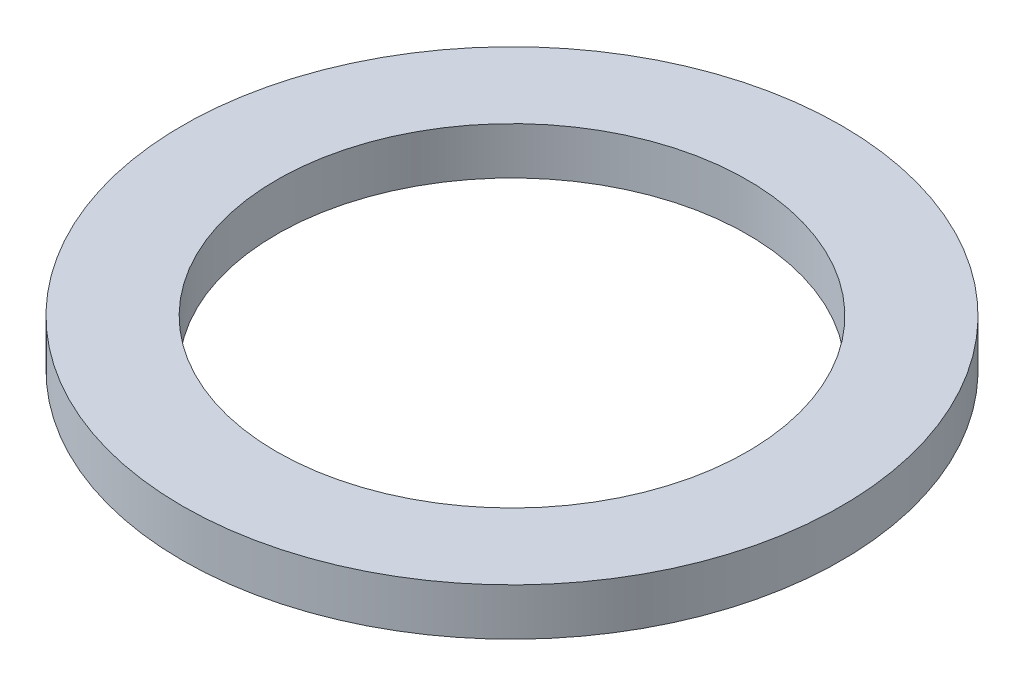
ISO-10303-21;
HEADER;
FILE_DESCRIPTION(('STEP AP214'),'2;1');
FILE_NAME('part.step','',(''),(''),'','','');
FILE_SCHEMA(('AUTOMOTIVE_DESIGN { 1 0 10303 214 1 1 1 1 }'));
ENDSEC;
DATA;
#1=APPLICATION_CONTEXT('core data for automotive mechanical design processes');
#2=APPLICATION_PROTOCOL_DEFINITION('international standard','automotive_design',2000,#1);
#3=PRODUCT_CONTEXT('',#1,'mechanical');
#4=PRODUCT('Part','Part','',(#3));
#5=PRODUCT_RELATED_PRODUCT_CATEGORY('part','',(#4));
#6=PRODUCT_DEFINITION_FORMATION('','',#4);
#7=PRODUCT_DEFINITION_CONTEXT('part definition',#1,'design');
#8=PRODUCT_DEFINITION('design','',#6,#7);
#9=PRODUCT_DEFINITION_SHAPE('','',#8);
#10=(LENGTH_UNIT() NAMED_UNIT(*) SI_UNIT(.MILLI.,.METRE.));
#11=(NAMED_UNIT(*) PLANE_ANGLE_UNIT() SI_UNIT($,.RADIAN.));
#12=(NAMED_UNIT(*) SI_UNIT($,.STERADIAN.) SOLID_ANGLE_UNIT());
#13=UNCERTAINTY_MEASURE_WITH_UNIT(LENGTH_MEASURE(1.E-05),#10,'distance_accuracy_value','');
#14=(GEOMETRIC_REPRESENTATION_CONTEXT(3) GLOBAL_UNCERTAINTY_ASSIGNED_CONTEXT((#13)) GLOBAL_UNIT_ASSIGNED_CONTEXT((#10,
#11,#12)) REPRESENTATION_CONTEXT('',''));
#15=CARTESIAN_POINT('',(0.,0.,0.));
#16=DIRECTION('',(0.,0.,1.));
#17=DIRECTION('',(1.,0.,0.));
#18=AXIS2_PLACEMENT_3D('',#15,#16,#17);
#19=CARTESIAN_POINT('',(0.,0.5,0.));
#20=DIRECTION('',(0.,1.,0.));
#21=DIRECTION('',(0.,0.,1.));
#22=AXIS2_PLACEMENT_3D('',#19,#20,#21);
#23=PLANE('',#22);
#24=CARTESIAN_POINT('',(0.,0.5,0.));
#25=DIRECTION('',(0.,1.,0.));
#26=DIRECTION('',(0.,0.,1.));
#27=AXIS2_PLACEMENT_3D('',#24,#25,#26);
#28=CIRCLE('',#27,3.5);
#29=CARTESIAN_POINT('',(0.,0.5,3.5));
#30=VERTEX_POINT('',#29);
#31=EDGE_CURVE('E10',#30,#30,#28,.T.);
#32=ORIENTED_EDGE('',*,*,#31,.T.);
#33=EDGE_LOOP('',(#32));
#34=FACE_BOUND('',#33,.T.);
#35=CARTESIAN_POINT('',(0.,0.5,0.));
#36=DIRECTION('',(0.,1.,0.));
#37=DIRECTION('',(0.,0.,1.));
#38=AXIS2_PLACEMENT_3D('',#35,#36,#37);
#39=CIRCLE('',#38,2.5);
#40=CARTESIAN_POINT('',(0.,0.5,2.5));
#41=VERTEX_POINT('',#40);
#42=EDGE_CURVE('E50',#41,#41,#39,.T.);
#43=ORIENTED_EDGE('',*,*,#42,.F.);
#44=EDGE_LOOP('',(#43));
#45=FACE_BOUND('',#44,.T.);
#46=ADVANCED_FACE('F39',(#34,#45),#23,.T.);
#47=CARTESIAN_POINT('',(0.,0.,0.));
#48=DIRECTION('',(0.,1.,0.));
#49=DIRECTION('',(0.,0.,1.));
#50=AXIS2_PLACEMENT_3D('',#47,#48,#49);
#51=PLANE('',#50);
#52=CARTESIAN_POINT('',(0.,0.,0.));
#53=DIRECTION('',(0.,1.,0.));
#54=DIRECTION('',(0.,0.,1.));
#55=AXIS2_PLACEMENT_3D('',#52,#53,#54);
#56=CIRCLE('',#55,3.5);
#57=CARTESIAN_POINT('',(0.,0.,3.5));
#58=VERTEX_POINT('',#57);
#59=EDGE_CURVE('E43',#58,#58,#56,.T.);
#60=ORIENTED_EDGE('',*,*,#59,.F.);
#61=EDGE_LOOP('',(#60));
#62=FACE_BOUND('',#61,.T.);
#63=CARTESIAN_POINT('',(0.,0.,0.));
#64=DIRECTION('',(0.,1.,0.));
#65=DIRECTION('',(0.,0.,1.));
#66=AXIS2_PLACEMENT_3D('',#63,#64,#65);
#67=CIRCLE('',#66,2.5);
#68=CARTESIAN_POINT('',(0.,0.,2.5));
#69=VERTEX_POINT('',#68);
#70=EDGE_CURVE('E52',#69,#69,#67,.T.);
#71=ORIENTED_EDGE('',*,*,#70,.T.);
#72=EDGE_LOOP('',(#71));
#73=FACE_BOUND('',#72,.T.);
#74=ADVANCED_FACE('F62',(#62,#73),#51,.F.);
#75=CARTESIAN_POINT('',(0.,0.5,0.));
#76=DIRECTION('',(0.,-1.,0.));
#77=DIRECTION('',(0.,0.,-1.));
#78=AXIS2_PLACEMENT_3D('',#75,#76,#77);
#79=CYLINDRICAL_SURFACE('',#78,3.5);
#80=ORIENTED_EDGE('',*,*,#31,.F.);
#81=EDGE_LOOP('',(#80));
#82=FACE_BOUND('',#81,.T.);
#83=ORIENTED_EDGE('',*,*,#59,.T.);
#84=EDGE_LOOP('',(#83));
#85=FACE_BOUND('',#84,.T.);
#86=ADVANCED_FACE('F41',(#82,#85),#79,.T.);
#87=CARTESIAN_POINT('',(0.,0.5,0.));
#88=DIRECTION('',(0.,-1.,0.));
#89=DIRECTION('',(0.,0.,-1.));
#90=AXIS2_PLACEMENT_3D('',#87,#88,#89);
#91=CYLINDRICAL_SURFACE('',#90,2.5);
#92=ORIENTED_EDGE('',*,*,#42,.T.);
#93=EDGE_LOOP('',(#92));
#94=FACE_BOUND('',#93,.T.);
#95=ORIENTED_EDGE('',*,*,#70,.F.);
#96=EDGE_LOOP('',(#95));
#97=FACE_BOUND('',#96,.T.);
#98=ADVANCED_FACE('F58',(#94,#97),#91,.F.);
#99=CLOSED_SHELL('',(#46,#74,#86,#98));
#100=MANIFOLD_SOLID_BREP('B2',#99);
#101=ADVANCED_BREP_SHAPE_REPRESENTATION('',(#18,#100),#14);
#102=SHAPE_DEFINITION_REPRESENTATION(#9,#101);
ENDSEC;
END-ISO-10303-21;
